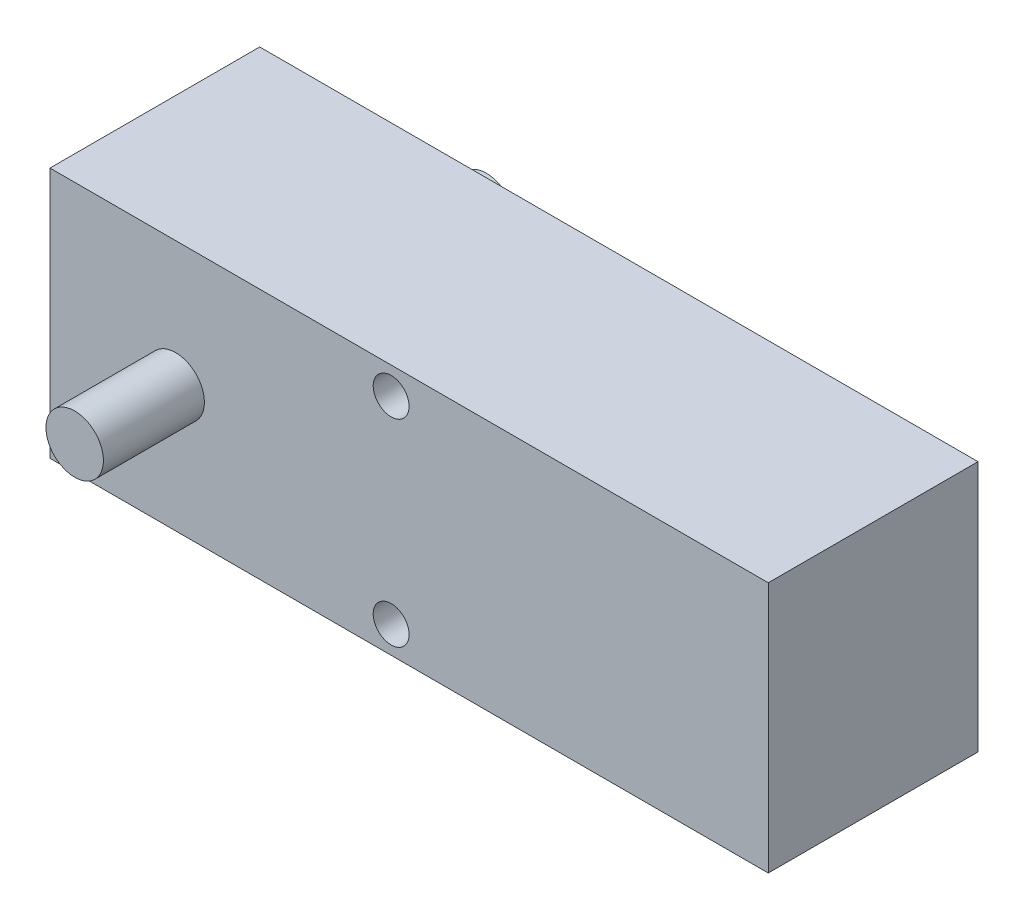
ISO-10303-21;
HEADER;
FILE_DESCRIPTION(('STEP AP214'),'2;1');
FILE_NAME('part.step','',(''),(''),'','','');
FILE_SCHEMA(('AUTOMOTIVE_DESIGN { 1 0 10303 214 1 1 1 1 }'));
ENDSEC;
DATA;
#1=APPLICATION_CONTEXT('core data for automotive mechanical design processes');
#2=APPLICATION_PROTOCOL_DEFINITION('international standard','automotive_design',2000,#1);
#3=PRODUCT_CONTEXT('',#1,'mechanical');
#4=PRODUCT('Part','Part','',(#3));
#5=PRODUCT_RELATED_PRODUCT_CATEGORY('part','',(#4));
#6=PRODUCT_DEFINITION_FORMATION('','',#4);
#7=PRODUCT_DEFINITION_CONTEXT('part definition',#1,'design');
#8=PRODUCT_DEFINITION('design','',#6,#7);
#9=PRODUCT_DEFINITION_SHAPE('','',#8);
#10=(LENGTH_UNIT() NAMED_UNIT(*) SI_UNIT(.MILLI.,.METRE.));
#11=(NAMED_UNIT(*) PLANE_ANGLE_UNIT() SI_UNIT($,.RADIAN.));
#12=(NAMED_UNIT(*) SI_UNIT($,.STERADIAN.) SOLID_ANGLE_UNIT());
#13=UNCERTAINTY_MEASURE_WITH_UNIT(LENGTH_MEASURE(1.E-05),#10,'distance_accuracy_value','');
#14=(GEOMETRIC_REPRESENTATION_CONTEXT(3) GLOBAL_UNCERTAINTY_ASSIGNED_CONTEXT((#13)) GLOBAL_UNIT_ASSIGNED_CONTEXT((#10,
#11,#12)) REPRESENTATION_CONTEXT('',''));
#15=CARTESIAN_POINT('',(0.,0.,0.));
#16=DIRECTION('',(0.,0.,1.));
#17=DIRECTION('',(1.,0.,0.));
#18=AXIS2_PLACEMENT_3D('',#15,#16,#17);
#19=CARTESIAN_POINT('',(0.,0.,18.1991));
#20=DIRECTION('',(0.,0.,-1.));
#21=DIRECTION('',(-1.,0.,0.));
#22=AXIS2_PLACEMENT_3D('',#19,#20,#21);
#23=CYLINDRICAL_SURFACE('',#22,2.54);
#24=CARTESIAN_POINT('',(0.,0.,9.271));
#25=DIRECTION('',(0.,0.,1.));
#26=DIRECTION('',(1.,0.,0.));
#27=AXIS2_PLACEMENT_3D('',#24,#25,#26);
#28=CIRCLE('',#27,2.54);
#29=CARTESIAN_POINT('',(2.54,0.,9.271));
#30=VERTEX_POINT('',#29);
#31=EDGE_CURVE('E118',#30,#30,#28,.T.);
#32=ORIENTED_EDGE('',*,*,#31,.T.);
#33=EDGE_LOOP('',(#32));
#34=FACE_BOUND('',#33,.T.);
#35=CARTESIAN_POINT('',(0.,0.,18.1991));
#36=DIRECTION('',(0.,0.,1.));
#37=DIRECTION('',(1.,0.,0.));
#38=AXIS2_PLACEMENT_3D('',#35,#36,#37);
#39=CIRCLE('',#38,2.54);
#40=CARTESIAN_POINT('',(2.54,0.,18.1991));
#41=VERTEX_POINT('',#40);
#42=EDGE_CURVE('E48',#41,#41,#39,.T.);
#43=ORIENTED_EDGE('',*,*,#42,.F.);
#44=EDGE_LOOP('',(#43));
#45=FACE_BOUND('',#44,.T.);
#46=ADVANCED_FACE('F39',(#34,#45),#23,.T.);
#47=CARTESIAN_POINT('',(0.,0.,18.1991));
#48=DIRECTION('',(0.,0.,1.));
#49=DIRECTION('',(1.,0.,0.));
#50=AXIS2_PLACEMENT_3D('',#47,#48,#49);
#51=PLANE('',#50);
#52=ORIENTED_EDGE('',*,*,#42,.T.);
#53=EDGE_LOOP('',(#52));
#54=FACE_BOUND('',#53,.T.);
#55=ADVANCED_FACE('F152',(#54),#51,.T.);
#56=CARTESIAN_POINT('',(-11.1125,11.1125,9.271));
#57=DIRECTION('',(1.,0.,0.));
#58=DIRECTION('',(0.,1.,0.));
#59=AXIS2_PLACEMENT_3D('',#56,#57,#58);
#60=PLANE('',#59);
#61=DIRECTION('',(0.,-1.,0.));
#62=VECTOR('',#61,1.);
#63=CARTESIAN_POINT('',(-11.1125,11.1125,-9.271));
#64=LINE('',#63,#62);
#65=CARTESIAN_POINT('',(-11.1125,11.1125,-9.271));
#66=VERTEX_POINT('',#65);
#67=CARTESIAN_POINT('',(-11.1125,-11.1125,-9.271));
#68=VERTEX_POINT('',#67);
#69=EDGE_CURVE('E108',#66,#68,#64,.T.);
#70=ORIENTED_EDGE('',*,*,#69,.T.);
#71=DIRECTION('',(0.,0.,-1.));
#72=VECTOR('',#71,1.);
#73=CARTESIAN_POINT('',(-11.1125,-11.1125,9.271));
#74=LINE('',#73,#72);
#75=CARTESIAN_POINT('',(-11.1125,-11.1125,9.271));
#76=VERTEX_POINT('',#75);
#77=EDGE_CURVE('E99',#76,#68,#74,.T.);
#78=ORIENTED_EDGE('',*,*,#77,.F.);
#79=DIRECTION('',(0.,-1.,0.));
#80=VECTOR('',#79,1.);
#81=CARTESIAN_POINT('',(-11.1125,11.1125,9.271));
#82=LINE('',#81,#80);
#83=CARTESIAN_POINT('',(-11.1125,11.1125,9.271));
#84=VERTEX_POINT('',#83);
#85=EDGE_CURVE('E93',#84,#76,#82,.T.);
#86=ORIENTED_EDGE('',*,*,#85,.F.);
#87=DIRECTION('',(0.,0.,-1.));
#88=VECTOR('',#87,1.);
#89=CARTESIAN_POINT('',(-11.1125,11.1125,9.271));
#90=LINE('',#89,#88);
#91=EDGE_CURVE('E104',#84,#66,#90,.T.);
#92=ORIENTED_EDGE('',*,*,#91,.T.);
#93=EDGE_LOOP('',(#70,#78,#86,#92));
#94=FACE_BOUND('',#93,.T.);
#95=ADVANCED_FACE('F157',(#94),#60,.F.);
#96=CARTESIAN_POINT('',(-11.1125,-11.1125,9.271));
#97=DIRECTION('',(0.,1.,0.));
#98=DIRECTION('',(-1.,0.,0.));
#99=AXIS2_PLACEMENT_3D('',#96,#97,#98);
#100=PLANE('',#99);
#101=DIRECTION('',(1.,0.,0.));
#102=VECTOR('',#101,1.);
#103=CARTESIAN_POINT('',(-11.1125,-11.1125,-9.271));
#104=LINE('',#103,#102);
#105=CARTESIAN_POINT('',(52.3875,-11.1125,-9.271));
#106=VERTEX_POINT('',#105);
#107=EDGE_CURVE('E98',#68,#106,#104,.T.);
#108=ORIENTED_EDGE('',*,*,#107,.T.);
#109=DIRECTION('',(0.,0.,-1.));
#110=VECTOR('',#109,1.);
#111=CARTESIAN_POINT('',(52.3875,-11.1125,9.271));
#112=LINE('',#111,#110);
#113=CARTESIAN_POINT('',(52.3875,-11.1125,9.271));
#114=VERTEX_POINT('',#113);
#115=EDGE_CURVE('E96',#114,#106,#112,.T.);
#116=ORIENTED_EDGE('',*,*,#115,.F.);
#117=DIRECTION('',(1.,0.,0.));
#118=VECTOR('',#117,1.);
#119=CARTESIAN_POINT('',(-11.1125,-11.1125,9.271));
#120=LINE('',#119,#118);
#121=EDGE_CURVE('E88',#76,#114,#120,.T.);
#122=ORIENTED_EDGE('',*,*,#121,.F.);
#123=ORIENTED_EDGE('',*,*,#77,.T.);
#124=EDGE_LOOP('',(#108,#116,#122,#123));
#125=FACE_BOUND('',#124,.T.);
#126=ADVANCED_FACE('F97',(#125),#100,.F.);
#127=CARTESIAN_POINT('',(52.3875,11.1125,9.271));
#128=DIRECTION('',(-1.,0.,0.));
#129=DIRECTION('',(0.,0.,1.));
#130=AXIS2_PLACEMENT_3D('',#127,#128,#129);
#131=PLANE('',#130);
#132=DIRECTION('',(0.,1.,0.));
#133=VECTOR('',#132,1.);
#134=CARTESIAN_POINT('',(52.3875,11.1125,-9.271));
#135=LINE('',#134,#133);
#136=CARTESIAN_POINT('',(52.3875,11.1125,-9.271));
#137=VERTEX_POINT('',#136);
#138=EDGE_CURVE('E74',#106,#137,#135,.T.);
#139=ORIENTED_EDGE('',*,*,#138,.T.);
#140=DIRECTION('',(0.,0.,-1.));
#141=VECTOR('',#140,1.);
#142=CARTESIAN_POINT('',(52.3875,11.1125,9.271));
#143=LINE('',#142,#141);
#144=CARTESIAN_POINT('',(52.3875,11.1125,9.271));
#145=VERTEX_POINT('',#144);
#146=EDGE_CURVE('E100',#145,#137,#143,.T.);
#147=ORIENTED_EDGE('',*,*,#146,.F.);
#148=DIRECTION('',(0.,1.,0.));
#149=VECTOR('',#148,1.);
#150=CARTESIAN_POINT('',(52.3875,11.1125,9.271));
#151=LINE('',#150,#149);
#152=EDGE_CURVE('E91',#114,#145,#151,.T.);
#153=ORIENTED_EDGE('',*,*,#152,.F.);
#154=ORIENTED_EDGE('',*,*,#115,.T.);
#155=EDGE_LOOP('',(#139,#147,#153,#154));
#156=FACE_BOUND('',#155,.T.);
#157=ADVANCED_FACE('F102',(#156),#131,.F.);
#158=CARTESIAN_POINT('',(-11.1125,11.1125,9.271));
#159=DIRECTION('',(0.,-1.,0.));
#160=DIRECTION('',(0.,0.,-1.));
#161=AXIS2_PLACEMENT_3D('',#158,#159,#160);
#162=PLANE('',#161);
#163=DIRECTION('',(-1.,0.,0.));
#164=VECTOR('',#163,1.);
#165=CARTESIAN_POINT('',(-11.1125,11.1125,-9.271));
#166=LINE('',#165,#164);
#167=EDGE_CURVE('E80',#137,#66,#166,.T.);
#168=ORIENTED_EDGE('',*,*,#167,.T.);
#169=ORIENTED_EDGE('',*,*,#91,.F.);
#170=DIRECTION('',(-1.,0.,0.));
#171=VECTOR('',#170,1.);
#172=CARTESIAN_POINT('',(-11.1125,11.1125,9.271));
#173=LINE('',#172,#171);
#174=EDGE_CURVE('E57',#145,#84,#173,.T.);
#175=ORIENTED_EDGE('',*,*,#174,.F.);
#176=ORIENTED_EDGE('',*,*,#146,.T.);
#177=EDGE_LOOP('',(#168,#169,#175,#176));
#178=FACE_BOUND('',#177,.T.);
#179=ADVANCED_FACE('F145',(#178),#162,.F.);
#180=CARTESIAN_POINT('',(0.,0.,9.271));
#181=DIRECTION('',(0.,0.,1.));
#182=DIRECTION('',(1.,0.,0.));
#183=AXIS2_PLACEMENT_3D('',#180,#181,#182);
#184=PLANE('',#183);
#185=CARTESIAN_POINT('',(19.05,-8.73125,9.271));
#186=DIRECTION('',(0.,0.,1.));
#187=DIRECTION('',(1.,0.,0.));
#188=AXIS2_PLACEMENT_3D('',#185,#186,#187);
#189=CIRCLE('',#188,1.5875);
#190=CARTESIAN_POINT('',(20.6375,-8.73125,9.271));
#191=VERTEX_POINT('',#190);
#192=EDGE_CURVE('E111',#191,#191,#189,.T.);
#193=ORIENTED_EDGE('',*,*,#192,.F.);
#194=EDGE_LOOP('',(#193));
#195=FACE_BOUND('',#194,.T.);
#196=CARTESIAN_POINT('',(19.05,8.73125,9.271));
#197=DIRECTION('',(0.,0.,1.));
#198=DIRECTION('',(1.,0.,0.));
#199=AXIS2_PLACEMENT_3D('',#196,#197,#198);
#200=CIRCLE('',#199,1.5875);
#201=CARTESIAN_POINT('',(20.6375,8.73125,9.271));
#202=VERTEX_POINT('',#201);
#203=EDGE_CURVE('E127',#202,#202,#200,.T.);
#204=ORIENTED_EDGE('',*,*,#203,.F.);
#205=EDGE_LOOP('',(#204));
#206=FACE_BOUND('',#205,.T.);
#207=ORIENTED_EDGE('',*,*,#31,.F.);
#208=EDGE_LOOP('',(#207));
#209=FACE_BOUND('',#208,.T.);
#210=ORIENTED_EDGE('',*,*,#85,.T.);
#211=ORIENTED_EDGE('',*,*,#121,.T.);
#212=ORIENTED_EDGE('',*,*,#152,.T.);
#213=ORIENTED_EDGE('',*,*,#174,.T.);
#214=EDGE_LOOP('',(#210,#211,#212,#213));
#215=FACE_BOUND('',#214,.T.);
#216=ADVANCED_FACE('F89',(#195,#206,#209,#215),#184,.T.);
#217=CARTESIAN_POINT('',(0.,0.,-9.271));
#218=DIRECTION('',(0.,0.,1.));
#219=DIRECTION('',(1.,0.,0.));
#220=AXIS2_PLACEMENT_3D('',#217,#218,#219);
#221=PLANE('',#220);
#222=CARTESIAN_POINT('',(19.05,-8.73125,-9.271));
#223=DIRECTION('',(0.,0.,1.));
#224=DIRECTION('',(1.,0.,0.));
#225=AXIS2_PLACEMENT_3D('',#222,#223,#224);
#226=CIRCLE('',#225,1.5875);
#227=CARTESIAN_POINT('',(20.6375,-8.73125,-9.271));
#228=VERTEX_POINT('',#227);
#229=EDGE_CURVE('E42',#228,#228,#226,.T.);
#230=ORIENTED_EDGE('',*,*,#229,.T.);
#231=EDGE_LOOP('',(#230));
#232=FACE_BOUND('',#231,.T.);
#233=CARTESIAN_POINT('',(19.05,8.73125,-9.271));
#234=DIRECTION('',(0.,0.,1.));
#235=DIRECTION('',(1.,0.,0.));
#236=AXIS2_PLACEMENT_3D('',#233,#234,#235);
#237=CIRCLE('',#236,1.5875);
#238=CARTESIAN_POINT('',(20.6375,8.73125,-9.271));
#239=VERTEX_POINT('',#238);
#240=EDGE_CURVE('E125',#239,#239,#237,.T.);
#241=ORIENTED_EDGE('',*,*,#240,.T.);
#242=EDGE_LOOP('',(#241));
#243=FACE_BOUND('',#242,.T.);
#244=CARTESIAN_POINT('',(0.,0.,-9.271));
#245=DIRECTION('',(0.,0.,1.));
#246=DIRECTION('',(1.,0.,0.));
#247=AXIS2_PLACEMENT_3D('',#244,#245,#246);
#248=CIRCLE('',#247,2.54);
#249=CARTESIAN_POINT('',(2.54,0.,-9.271));
#250=VERTEX_POINT('',#249);
#251=EDGE_CURVE('E11',#250,#250,#248,.T.);
#252=ORIENTED_EDGE('',*,*,#251,.T.);
#253=EDGE_LOOP('',(#252));
#254=FACE_BOUND('',#253,.T.);
#255=ORIENTED_EDGE('',*,*,#69,.F.);
#256=ORIENTED_EDGE('',*,*,#167,.F.);
#257=ORIENTED_EDGE('',*,*,#138,.F.);
#258=ORIENTED_EDGE('',*,*,#107,.F.);
#259=EDGE_LOOP('',(#255,#256,#257,#258));
#260=FACE_BOUND('',#259,.T.);
#261=ADVANCED_FACE('F144',(#232,#243,#254,#260),#221,.F.);
#262=CARTESIAN_POINT('',(0.,0.,-18.1991));
#263=DIRECTION('',(0.,0.,1.));
#264=DIRECTION('',(1.,0.,0.));
#265=AXIS2_PLACEMENT_3D('',#262,#263,#264);
#266=PLANE('',#265);
#267=CARTESIAN_POINT('',(0.,0.,-18.1991));
#268=DIRECTION('',(0.,0.,1.));
#269=DIRECTION('',(1.,0.,0.));
#270=AXIS2_PLACEMENT_3D('',#267,#268,#269);
#271=CIRCLE('',#270,2.54);
#272=CARTESIAN_POINT('',(2.54,0.,-18.1991));
#273=VERTEX_POINT('',#272);
#274=EDGE_CURVE('E121',#273,#273,#271,.T.);
#275=ORIENTED_EDGE('',*,*,#274,.F.);
#276=EDGE_LOOP('',(#275));
#277=FACE_BOUND('',#276,.T.);
#278=ADVANCED_FACE('F166',(#277),#266,.F.);
#279=ORIENTED_EDGE('',*,*,#274,.T.);
#280=EDGE_LOOP('',(#279));
#281=FACE_BOUND('',#280,.T.);
#282=ORIENTED_EDGE('',*,*,#251,.F.);
#283=EDGE_LOOP('',(#282));
#284=FACE_BOUND('',#283,.T.);
#285=ADVANCED_FACE('F153',(#281,#284),#23,.T.);
#286=CARTESIAN_POINT('',(19.05,8.73125,-18.1991));
#287=DIRECTION('',(0.,0.,1.));
#288=DIRECTION('',(1.,0.,0.));
#289=AXIS2_PLACEMENT_3D('',#286,#287,#288);
#290=CYLINDRICAL_SURFACE('',#289,1.5875);
#291=ORIENTED_EDGE('',*,*,#203,.T.);
#292=EDGE_LOOP('',(#291));
#293=FACE_BOUND('',#292,.T.);
#294=ORIENTED_EDGE('',*,*,#240,.F.);
#295=EDGE_LOOP('',(#294));
#296=FACE_BOUND('',#295,.T.);
#297=ADVANCED_FACE('F171',(#293,#296),#290,.F.);
#298=CARTESIAN_POINT('',(19.05,-8.73125,-18.1991));
#299=DIRECTION('',(0.,0.,1.));
#300=DIRECTION('',(1.,0.,0.));
#301=AXIS2_PLACEMENT_3D('',#298,#299,#300);
#302=CYLINDRICAL_SURFACE('',#301,1.5875);
#303=ORIENTED_EDGE('',*,*,#192,.T.);
#304=EDGE_LOOP('',(#303));
#305=FACE_BOUND('',#304,.T.);
#306=ORIENTED_EDGE('',*,*,#229,.F.);
#307=EDGE_LOOP('',(#306));
#308=FACE_BOUND('',#307,.T.);
#309=ADVANCED_FACE('F139',(#305,#308),#302,.F.);
#310=CLOSED_SHELL('',(#46,#55,#95,#126,#157,#179,#216,#261,#278,#285,#297,#309));
#311=MANIFOLD_SOLID_BREP('B2',#310);
#312=ADVANCED_BREP_SHAPE_REPRESENTATION('',(#18,#311),#14);
#313=SHAPE_DEFINITION_REPRESENTATION(#9,#312);
ENDSEC;
END-ISO-10303-21;
